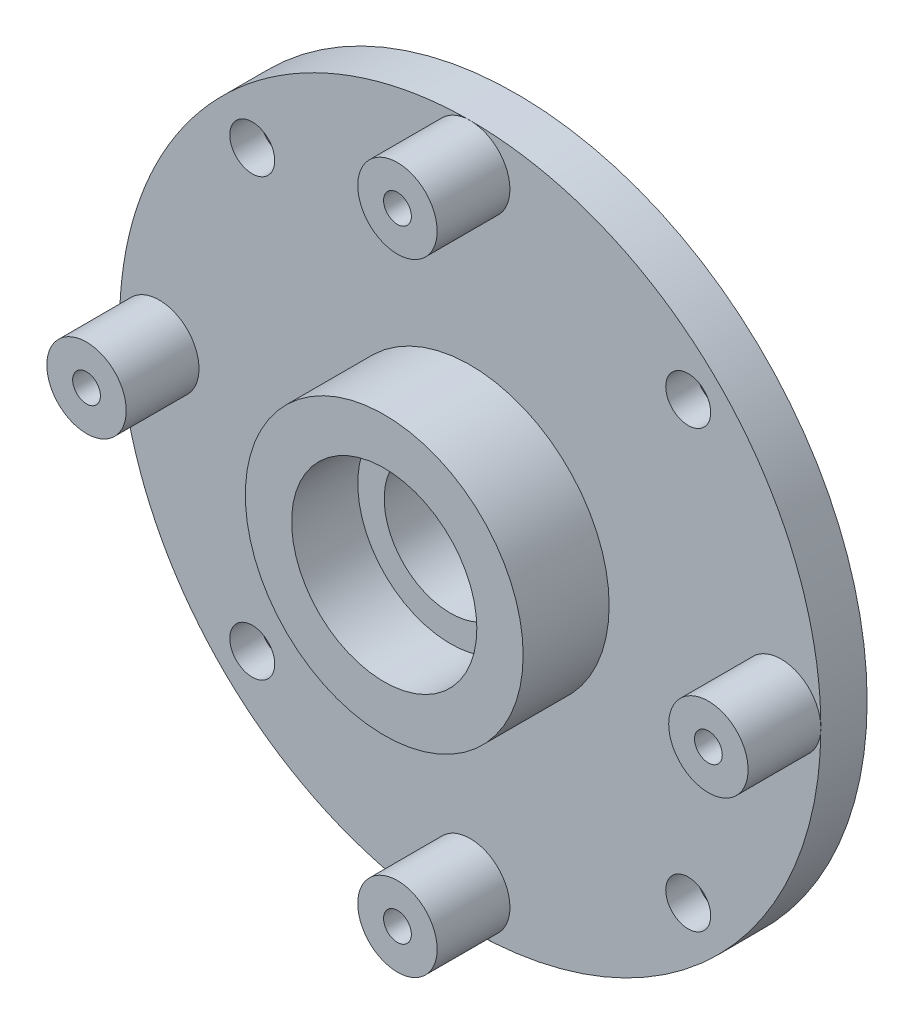
ISO-10303-21;
HEADER;
FILE_DESCRIPTION(('STEP AP214'),'2;1');
FILE_NAME('part.step','',(''),(''),'','','');
FILE_SCHEMA(('AUTOMOTIVE_DESIGN { 1 0 10303 214 1 1 1 1 }'));
ENDSEC;
DATA;
#1=APPLICATION_CONTEXT('core data for automotive mechanical design processes');
#2=APPLICATION_PROTOCOL_DEFINITION('international standard','automotive_design',2000,#1);
#3=PRODUCT_CONTEXT('',#1,'mechanical');
#4=PRODUCT('Part','Part','',(#3));
#5=PRODUCT_RELATED_PRODUCT_CATEGORY('part','',(#4));
#6=PRODUCT_DEFINITION_FORMATION('','',#4);
#7=PRODUCT_DEFINITION_CONTEXT('part definition',#1,'design');
#8=PRODUCT_DEFINITION('design','',#6,#7);
#9=PRODUCT_DEFINITION_SHAPE('','',#8);
#10=(LENGTH_UNIT() NAMED_UNIT(*) SI_UNIT(.MILLI.,.METRE.));
#11=(NAMED_UNIT(*) PLANE_ANGLE_UNIT() SI_UNIT($,.RADIAN.));
#12=(NAMED_UNIT(*) SI_UNIT($,.STERADIAN.) SOLID_ANGLE_UNIT());
#13=UNCERTAINTY_MEASURE_WITH_UNIT(LENGTH_MEASURE(1.E-05),#10,'distance_accuracy_value','');
#14=(GEOMETRIC_REPRESENTATION_CONTEXT(3) GLOBAL_UNCERTAINTY_ASSIGNED_CONTEXT((#13)) GLOBAL_UNIT_ASSIGNED_CONTEXT((#10,
#11,#12)) REPRESENTATION_CONTEXT('',''));
#15=CARTESIAN_POINT('',(0.,0.,0.));
#16=DIRECTION('',(0.,0.,1.));
#17=DIRECTION('',(1.,0.,0.));
#18=AXIS2_PLACEMENT_3D('',#15,#16,#17);
#19=CARTESIAN_POINT('',(0.,0.,10.));
#20=DIRECTION('',(0.,0.,1.));
#21=DIRECTION('',(1.,0.,0.));
#22=AXIS2_PLACEMENT_3D('',#19,#20,#21);
#23=CYLINDRICAL_SURFACE('',#22,5.);
#24=CARTESIAN_POINT('',(0.,0.,-35.2));
#25=DIRECTION('',(0.,0.,1.));
#26=DIRECTION('',(1.,0.,0.));
#27=AXIS2_PLACEMENT_3D('',#24,#25,#26);
#28=CIRCLE('',#27,5.);
#29=CARTESIAN_POINT('',(5.,0.,-35.2));
#30=VERTEX_POINT('',#29);
#31=EDGE_CURVE('E89',#30,#30,#28,.T.);
#32=ORIENTED_EDGE('',*,*,#31,.T.);
#33=EDGE_LOOP('',(#32));
#34=FACE_BOUND('',#33,.T.);
#35=CARTESIAN_POINT('',(0.,0.,-40.2));
#36=DIRECTION('',(0.,0.,1.));
#37=DIRECTION('',(1.,0.,0.));
#38=AXIS2_PLACEMENT_3D('',#35,#36,#37);
#39=CIRCLE('',#38,5.);
#40=CARTESIAN_POINT('',(5.,0.,-40.2));
#41=VERTEX_POINT('',#40);
#42=EDGE_CURVE('E113',#41,#41,#39,.T.);
#43=ORIENTED_EDGE('',*,*,#42,.F.);
#44=EDGE_LOOP('',(#43));
#45=FACE_BOUND('',#44,.T.);
#46=ADVANCED_FACE('F41',(#34,#45),#23,.F.);
#47=CARTESIAN_POINT('',(5.,0.,-40.2));
#48=DIRECTION('',(0.,0.,-1.));
#49=DIRECTION('',(-1.,0.,0.));
#50=AXIS2_PLACEMENT_3D('',#47,#48,#49);
#51=PLANE('',#50);
#52=CARTESIAN_POINT('',(16.4755880016464,16.4755880016467,-40.2));
#53=DIRECTION('',(0.,0.,-1.));
#54=DIRECTION('',(-1.,0.,0.));
#55=AXIS2_PLACEMENT_3D('',#52,#53,#54);
#56=CIRCLE('',#55,2.79999999999999);
#57=CARTESIAN_POINT('',(13.6755880016464,16.4755880016467,-40.2));
#58=VERTEX_POINT('',#57);
#59=EDGE_CURVE('E152',#58,#58,#56,.F.);
#60=ORIENTED_EDGE('',*,*,#59,.T.);
#61=EDGE_LOOP('',(#60));
#62=FACE_BOUND('',#61,.T.);
#63=CARTESIAN_POINT('',(16.4755880016466,-16.4755880016466,-40.2));
#64=DIRECTION('',(0.,0.,-1.));
#65=DIRECTION('',(-1.,0.,0.));
#66=AXIS2_PLACEMENT_3D('',#63,#64,#65);
#67=CIRCLE('',#66,2.79999999999999);
#68=CARTESIAN_POINT('',(13.6755880016466,-16.4755880016466,-40.2));
#69=VERTEX_POINT('',#68);
#70=EDGE_CURVE('E149',#69,#69,#67,.F.);
#71=ORIENTED_EDGE('',*,*,#70,.T.);
#72=EDGE_LOOP('',(#71));
#73=FACE_BOUND('',#72,.T.);
#74=CARTESIAN_POINT('',(-16.4755880016465,-16.4755880016466,-40.2));
#75=DIRECTION('',(0.,0.,-1.));
#76=DIRECTION('',(-1.,0.,0.));
#77=AXIS2_PLACEMENT_3D('',#74,#75,#76);
#78=CIRCLE('',#77,2.80000000000001);
#79=CARTESIAN_POINT('',(-19.2755880016465,-16.4755880016466,-40.2));
#80=VERTEX_POINT('',#79);
#81=EDGE_CURVE('E146',#80,#80,#78,.F.);
#82=ORIENTED_EDGE('',*,*,#81,.T.);
#83=EDGE_LOOP('',(#82));
#84=FACE_BOUND('',#83,.T.);
#85=CARTESIAN_POINT('',(-16.4755880016466,16.4755880016466,-40.2));
#86=DIRECTION('',(0.,0.,-1.));
#87=DIRECTION('',(-1.,0.,0.));
#88=AXIS2_PLACEMENT_3D('',#85,#86,#87);
#89=CIRCLE('',#88,2.79999999999999);
#90=CARTESIAN_POINT('',(-19.2755880016466,16.4755880016466,-40.2));
#91=VERTEX_POINT('',#90);
#92=EDGE_CURVE('E116',#91,#91,#89,.F.);
#93=ORIENTED_EDGE('',*,*,#92,.T.);
#94=EDGE_LOOP('',(#93));
#95=FACE_BOUND('',#94,.T.);
#96=CARTESIAN_POINT('',(1.6985546288162E-13,-23.5,-40.2));
#97=DIRECTION('',(0.,0.,1.));
#98=DIRECTION('',(0.,1.,0.));
#99=AXIS2_PLACEMENT_3D('',#96,#97,#98);
#100=CIRCLE('',#99,1.05);
#101=CARTESIAN_POINT('',(1.66189407475835E-13,-22.45,-40.2));
#102=VERTEX_POINT('',#101);
#103=EDGE_CURVE('E125',#102,#102,#100,.T.);
#104=ORIENTED_EDGE('',*,*,#103,.T.);
#105=EDGE_LOOP('',(#104));
#106=FACE_BOUND('',#105,.T.);
#107=CARTESIAN_POINT('',(23.5,0.,-40.2));
#108=DIRECTION('',(0.,0.,1.));
#109=DIRECTION('',(-1.,0.,0.));
#110=AXIS2_PLACEMENT_3D('',#107,#108,#109);
#111=CIRCLE('',#110,1.05);
#112=CARTESIAN_POINT('',(22.45,0.,-40.2));
#113=VERTEX_POINT('',#112);
#114=EDGE_CURVE('E186',#113,#113,#111,.T.);
#115=ORIENTED_EDGE('',*,*,#114,.T.);
#116=EDGE_LOOP('',(#115));
#117=FACE_BOUND('',#116,.T.);
#118=CARTESIAN_POINT('',(-3.33955085807247E-13,23.5,-40.2));
#119=DIRECTION('',(0.,0.,1.));
#120=DIRECTION('',(0.,-1.,0.));
#121=AXIS2_PLACEMENT_3D('',#118,#119,#120);
#122=CIRCLE('',#121,1.05);
#123=CARTESIAN_POINT('',(-3.22956919589891E-13,22.45,-40.2));
#124=VERTEX_POINT('',#123);
#125=EDGE_CURVE('E134',#124,#124,#122,.T.);
#126=ORIENTED_EDGE('',*,*,#125,.T.);
#127=EDGE_LOOP('',(#126));
#128=FACE_BOUND('',#127,.T.);
#129=CARTESIAN_POINT('',(-23.5,0.,-40.2));
#130=DIRECTION('',(0.,0.,1.));
#131=DIRECTION('',(1.,0.,0.));
#132=AXIS2_PLACEMENT_3D('',#129,#130,#131);
#133=CIRCLE('',#132,1.05);
#134=CARTESIAN_POINT('',(-22.45,0.,-40.2));
#135=VERTEX_POINT('',#134);
#136=EDGE_CURVE('E120',#135,#135,#133,.T.);
#137=ORIENTED_EDGE('',*,*,#136,.T.);
#138=EDGE_LOOP('',(#137));
#139=FACE_BOUND('',#138,.T.);
#140=ORIENTED_EDGE('',*,*,#42,.T.);
#141=EDGE_LOOP('',(#140));
#142=FACE_BOUND('',#141,.T.);
#143=CARTESIAN_POINT('',(0.,0.,-40.2));
#144=DIRECTION('',(0.,0.,1.));
#145=DIRECTION('',(1.,0.,0.));
#146=AXIS2_PLACEMENT_3D('',#143,#144,#145);
#147=CIRCLE('',#146,26.5);
#148=CARTESIAN_POINT('',(26.5,0.,-40.2));
#149=VERTEX_POINT('',#148);
#150=EDGE_CURVE('E109',#149,#149,#147,.T.);
#151=ORIENTED_EDGE('',*,*,#150,.F.);
#152=EDGE_LOOP('',(#151));
#153=FACE_BOUND('',#152,.T.);
#154=ADVANCED_FACE('F172',(#62,#73,#84,#95,#106,#117,#128,#139,#142,#153),#51,.T.);
#155=CARTESIAN_POINT('',(0.,0.,10.));
#156=DIRECTION('',(0.,0.,1.));
#157=DIRECTION('',(1.,0.,0.));
#158=AXIS2_PLACEMENT_3D('',#155,#156,#157);
#159=CYLINDRICAL_SURFACE('',#158,26.5);
#160=ORIENTED_EDGE('',*,*,#150,.T.);
#161=EDGE_LOOP('',(#160));
#162=FACE_BOUND('',#161,.T.);
#163=CARTESIAN_POINT('',(0.,0.,-36.7));
#164=DIRECTION('',(0.,0.,1.));
#165=DIRECTION('',(1.,0.,0.));
#166=AXIS2_PLACEMENT_3D('',#163,#164,#165);
#167=CIRCLE('',#166,26.5);
#168=CARTESIAN_POINT('',(-26.5,0.,-36.7));
#169=VERTEX_POINT('',#168);
#170=CARTESIAN_POINT('',(1.91539138994167E-13,-26.5,-36.7));
#171=VERTEX_POINT('',#170);
#172=EDGE_CURVE('E82',#169,#171,#167,.T.);
#173=ORIENTED_EDGE('',*,*,#172,.F.);
#174=CARTESIAN_POINT('',(-3.76587649952853E-13,26.5,-36.7));
#175=VERTEX_POINT('',#174);
#176=EDGE_CURVE('E69',#175,#169,#167,.T.);
#177=ORIENTED_EDGE('',*,*,#176,.F.);
#178=CARTESIAN_POINT('',(26.5,0.,-36.7));
#179=VERTEX_POINT('',#178);
#180=EDGE_CURVE('E79',#179,#175,#167,.T.);
#181=ORIENTED_EDGE('',*,*,#180,.F.);
#182=EDGE_CURVE('E110',#171,#179,#167,.T.);
#183=ORIENTED_EDGE('',*,*,#182,.F.);
#184=EDGE_LOOP('',(#173,#177,#181,#183));
#185=FACE_BOUND('',#184,.T.);
#186=ADVANCED_FACE('F175',(#162,#185),#159,.T.);
#187=CARTESIAN_POINT('',(26.5,0.,-36.7));
#188=DIRECTION('',(0.,0.,1.));
#189=DIRECTION('',(1.,0.,0.));
#190=AXIS2_PLACEMENT_3D('',#187,#188,#189);
#191=PLANE('',#190);
#192=CARTESIAN_POINT('',(-16.4755880016465,-16.4755880016466,-36.7));
#193=DIRECTION('',(0.,0.,1.));
#194=DIRECTION('',(1.,0.,0.));
#195=AXIS2_PLACEMENT_3D('',#192,#193,#194);
#196=CIRCLE('',#195,1.7);
#197=CARTESIAN_POINT('',(-14.7755880016465,-16.4755880016466,-36.7));
#198=VERTEX_POINT('',#197);
#199=EDGE_CURVE('E135',#198,#198,#196,.F.);
#200=ORIENTED_EDGE('',*,*,#199,.T.);
#201=EDGE_LOOP('',(#200));
#202=FACE_BOUND('',#201,.T.);
#203=CARTESIAN_POINT('',(16.4755880016466,-16.4755880016466,-36.7));
#204=DIRECTION('',(0.,0.,1.));
#205=DIRECTION('',(1.,0.,0.));
#206=AXIS2_PLACEMENT_3D('',#203,#204,#205);
#207=CIRCLE('',#206,1.7);
#208=CARTESIAN_POINT('',(18.1755880016466,-16.4755880016466,-36.7));
#209=VERTEX_POINT('',#208);
#210=EDGE_CURVE('E139',#209,#209,#207,.F.);
#211=ORIENTED_EDGE('',*,*,#210,.T.);
#212=EDGE_LOOP('',(#211));
#213=FACE_BOUND('',#212,.T.);
#214=CARTESIAN_POINT('',(16.4755880016464,16.4755880016467,-36.7));
#215=DIRECTION('',(0.,0.,1.));
#216=DIRECTION('',(1.,0.,0.));
#217=AXIS2_PLACEMENT_3D('',#214,#215,#216);
#218=CIRCLE('',#217,1.7);
#219=CARTESIAN_POINT('',(18.1755880016464,16.4755880016467,-36.7));
#220=VERTEX_POINT('',#219);
#221=EDGE_CURVE('E136',#220,#220,#218,.F.);
#222=ORIENTED_EDGE('',*,*,#221,.T.);
#223=EDGE_LOOP('',(#222));
#224=FACE_BOUND('',#223,.T.);
#225=CARTESIAN_POINT('',(-16.4755880016466,16.4755880016466,-36.7));
#226=DIRECTION('',(0.,0.,1.));
#227=DIRECTION('',(1.,0.,0.));
#228=AXIS2_PLACEMENT_3D('',#225,#226,#227);
#229=CIRCLE('',#228,1.7);
#230=CARTESIAN_POINT('',(-14.7755880016466,16.4755880016466,-36.7));
#231=VERTEX_POINT('',#230);
#232=EDGE_CURVE('E131',#231,#231,#229,.F.);
#233=ORIENTED_EDGE('',*,*,#232,.T.);
#234=EDGE_LOOP('',(#233));
#235=FACE_BOUND('',#234,.T.);
#236=ORIENTED_EDGE('',*,*,#180,.T.);
#237=CARTESIAN_POINT('',(-3.33955085807247E-13,23.5,-36.7));
#238=DIRECTION('',(0.,0.,1.));
#239=DIRECTION('',(0.,-1.,0.));
#240=AXIS2_PLACEMENT_3D('',#237,#238,#239);
#241=CIRCLE('',#240,3.);
#242=EDGE_CURVE('E55',#175,#175,#241,.T.);
#243=ORIENTED_EDGE('',*,*,#242,.F.);
#244=ORIENTED_EDGE('',*,*,#176,.T.);
#245=CARTESIAN_POINT('',(-23.5,0.,-36.7));
#246=DIRECTION('',(0.,0.,1.));
#247=DIRECTION('',(1.,0.,0.));
#248=AXIS2_PLACEMENT_3D('',#245,#246,#247);
#249=CIRCLE('',#248,3.);
#250=EDGE_CURVE('E75',#169,#169,#249,.T.);
#251=ORIENTED_EDGE('',*,*,#250,.F.);
#252=ORIENTED_EDGE('',*,*,#172,.T.);
#253=CARTESIAN_POINT('',(1.6985546288162E-13,-23.5,-36.7));
#254=DIRECTION('',(0.,0.,1.));
#255=DIRECTION('',(0.,1.,0.));
#256=AXIS2_PLACEMENT_3D('',#253,#254,#255);
#257=CIRCLE('',#256,3.);
#258=EDGE_CURVE('E92',#171,#171,#257,.T.);
#259=ORIENTED_EDGE('',*,*,#258,.F.);
#260=ORIENTED_EDGE('',*,*,#182,.T.);
#261=CARTESIAN_POINT('',(23.5,0.,-36.7));
#262=DIRECTION('',(0.,0.,1.));
#263=DIRECTION('',(-1.,0.,0.));
#264=AXIS2_PLACEMENT_3D('',#261,#262,#263);
#265=CIRCLE('',#264,3.);
#266=EDGE_CURVE('E60',#179,#179,#265,.T.);
#267=ORIENTED_EDGE('',*,*,#266,.F.);
#268=EDGE_LOOP('',(#236,#243,#244,#251,#252,#259,#260,#267));
#269=FACE_BOUND('',#268,.T.);
#270=CARTESIAN_POINT('',(0.,0.,-36.7));
#271=DIRECTION('',(0.,0.,1.));
#272=DIRECTION('',(1.,0.,0.));
#273=AXIS2_PLACEMENT_3D('',#270,#271,#272);
#274=CIRCLE('',#273,10.5);
#275=CARTESIAN_POINT('',(10.5,0.,-36.7));
#276=VERTEX_POINT('',#275);
#277=EDGE_CURVE('E80',#276,#276,#274,.T.);
#278=ORIENTED_EDGE('',*,*,#277,.F.);
#279=EDGE_LOOP('',(#278));
#280=FACE_BOUND('',#279,.T.);
#281=ADVANCED_FACE('F72',(#202,#213,#224,#235,#269,#280),#191,.T.);
#282=CARTESIAN_POINT('',(0.,0.,10.));
#283=DIRECTION('',(0.,0.,1.));
#284=DIRECTION('',(1.,0.,0.));
#285=AXIS2_PLACEMENT_3D('',#282,#283,#284);
#286=CYLINDRICAL_SURFACE('',#285,10.5);
#287=ORIENTED_EDGE('',*,*,#277,.T.);
#288=EDGE_LOOP('',(#287));
#289=FACE_BOUND('',#288,.T.);
#290=CARTESIAN_POINT('',(0.,0.,-30.2));
#291=DIRECTION('',(0.,0.,1.));
#292=DIRECTION('',(1.,0.,0.));
#293=AXIS2_PLACEMENT_3D('',#290,#291,#292);
#294=CIRCLE('',#293,10.5);
#295=CARTESIAN_POINT('',(10.5,0.,-30.2));
#296=VERTEX_POINT('',#295);
#297=EDGE_CURVE('E104',#296,#296,#294,.T.);
#298=ORIENTED_EDGE('',*,*,#297,.F.);
#299=EDGE_LOOP('',(#298));
#300=FACE_BOUND('',#299,.T.);
#301=ADVANCED_FACE('F273',(#289,#300),#286,.T.);
#302=CARTESIAN_POINT('',(10.5,0.,-30.2));
#303=DIRECTION('',(0.,0.,1.));
#304=DIRECTION('',(1.,0.,0.));
#305=AXIS2_PLACEMENT_3D('',#302,#303,#304);
#306=PLANE('',#305);
#307=ORIENTED_EDGE('',*,*,#297,.T.);
#308=EDGE_LOOP('',(#307));
#309=FACE_BOUND('',#308,.T.);
#310=CARTESIAN_POINT('',(0.,0.,-30.2));
#311=DIRECTION('',(0.,0.,1.));
#312=DIRECTION('',(1.,0.,0.));
#313=AXIS2_PLACEMENT_3D('',#310,#311,#312);
#314=CIRCLE('',#313,7.);
#315=CARTESIAN_POINT('',(7.,0.,-30.2));
#316=VERTEX_POINT('',#315);
#317=EDGE_CURVE('E101',#316,#316,#314,.T.);
#318=ORIENTED_EDGE('',*,*,#317,.F.);
#319=EDGE_LOOP('',(#318));
#320=FACE_BOUND('',#319,.T.);
#321=ADVANCED_FACE('F329',(#309,#320),#306,.T.);
#322=CARTESIAN_POINT('',(0.,0.,10.));
#323=DIRECTION('',(0.,0.,1.));
#324=DIRECTION('',(1.,0.,0.));
#325=AXIS2_PLACEMENT_3D('',#322,#323,#324);
#326=CYLINDRICAL_SURFACE('',#325,7.);
#327=ORIENTED_EDGE('',*,*,#317,.T.);
#328=EDGE_LOOP('',(#327));
#329=FACE_BOUND('',#328,.T.);
#330=CARTESIAN_POINT('',(0.,0.,-35.2));
#331=DIRECTION('',(0.,0.,1.));
#332=DIRECTION('',(1.,0.,0.));
#333=AXIS2_PLACEMENT_3D('',#330,#331,#332);
#334=CIRCLE('',#333,7.);
#335=CARTESIAN_POINT('',(7.,0.,-35.2));
#336=VERTEX_POINT('',#335);
#337=EDGE_CURVE('E98',#336,#336,#334,.T.);
#338=ORIENTED_EDGE('',*,*,#337,.F.);
#339=EDGE_LOOP('',(#338));
#340=FACE_BOUND('',#339,.T.);
#341=ADVANCED_FACE('F322',(#329,#340),#326,.F.);
#342=CARTESIAN_POINT('',(7.,0.,-35.2));
#343=DIRECTION('',(0.,0.,1.));
#344=DIRECTION('',(1.,0.,0.));
#345=AXIS2_PLACEMENT_3D('',#342,#343,#344);
#346=PLANE('',#345);
#347=ORIENTED_EDGE('',*,*,#337,.T.);
#348=EDGE_LOOP('',(#347));
#349=FACE_BOUND('',#348,.T.);
#350=ORIENTED_EDGE('',*,*,#31,.F.);
#351=EDGE_LOOP('',(#350));
#352=FACE_BOUND('',#351,.T.);
#353=ADVANCED_FACE('F317',(#349,#352),#346,.T.);
#354=CARTESIAN_POINT('',(-23.5,0.,-31.2));
#355=DIRECTION('',(0.,0.,-1.));
#356=DIRECTION('',(-1.,0.,0.));
#357=AXIS2_PLACEMENT_3D('',#354,#355,#356);
#358=CYLINDRICAL_SURFACE('',#357,3.);
#359=CARTESIAN_POINT('',(-23.5,0.,-31.2));
#360=DIRECTION('',(0.,0.,1.));
#361=DIRECTION('',(1.,0.,0.));
#362=AXIS2_PLACEMENT_3D('',#359,#360,#361);
#363=CIRCLE('',#362,3.);
#364=CARTESIAN_POINT('',(-20.5,0.,-31.2));
#365=VERTEX_POINT('',#364);
#366=EDGE_CURVE('E85',#365,#365,#363,.T.);
#367=ORIENTED_EDGE('',*,*,#366,.F.);
#368=EDGE_LOOP('',(#367));
#369=FACE_BOUND('',#368,.T.);
#370=ORIENTED_EDGE('',*,*,#250,.T.);
#371=EDGE_LOOP('',(#370));
#372=FACE_BOUND('',#371,.T.);
#373=ADVANCED_FACE('F84',(#369,#372),#358,.T.);
#374=CARTESIAN_POINT('',(-23.5,0.,-31.2));
#375=DIRECTION('',(0.,0.,1.));
#376=DIRECTION('',(1.,0.,0.));
#377=AXIS2_PLACEMENT_3D('',#374,#375,#376);
#378=PLANE('',#377);
#379=CARTESIAN_POINT('',(-23.5,0.,-31.2));
#380=DIRECTION('',(0.,0.,1.));
#381=DIRECTION('',(1.,0.,0.));
#382=AXIS2_PLACEMENT_3D('',#379,#380,#381);
#383=CIRCLE('',#382,1.05);
#384=CARTESIAN_POINT('',(-22.45,0.,-31.2));
#385=VERTEX_POINT('',#384);
#386=EDGE_CURVE('E117',#385,#385,#383,.F.);
#387=ORIENTED_EDGE('',*,*,#386,.T.);
#388=EDGE_LOOP('',(#387));
#389=FACE_BOUND('',#388,.T.);
#390=ORIENTED_EDGE('',*,*,#366,.T.);
#391=EDGE_LOOP('',(#390));
#392=FACE_BOUND('',#391,.T.);
#393=ADVANCED_FACE('F309',(#389,#392),#378,.T.);
#394=CARTESIAN_POINT('',(1.6985546288162E-13,-23.5,-31.2));
#395=DIRECTION('',(0.,0.,-1.));
#396=DIRECTION('',(-1.,0.,0.));
#397=AXIS2_PLACEMENT_3D('',#394,#395,#396);
#398=CYLINDRICAL_SURFACE('',#397,3.);
#399=CARTESIAN_POINT('',(1.6985546288162E-13,-23.5,-31.2));
#400=DIRECTION('',(0.,0.,1.));
#401=DIRECTION('',(0.,1.,0.));
#402=AXIS2_PLACEMENT_3D('',#399,#400,#401);
#403=CIRCLE('',#402,3.);
#404=CARTESIAN_POINT('',(1.5938101886509E-13,-20.5,-31.2));
#405=VERTEX_POINT('',#404);
#406=EDGE_CURVE('E86',#405,#405,#403,.T.);
#407=ORIENTED_EDGE('',*,*,#406,.F.);
#408=EDGE_LOOP('',(#407));
#409=FACE_BOUND('',#408,.T.);
#410=ORIENTED_EDGE('',*,*,#258,.T.);
#411=EDGE_LOOP('',(#410));
#412=FACE_BOUND('',#411,.T.);
#413=ADVANCED_FACE('F312',(#409,#412),#398,.T.);
#414=CARTESIAN_POINT('',(1.6985546288162E-13,-23.5,-31.2));
#415=DIRECTION('',(0.,0.,1.));
#416=DIRECTION('',(0.,1.,0.));
#417=AXIS2_PLACEMENT_3D('',#414,#415,#416);
#418=PLANE('',#417);
#419=CARTESIAN_POINT('',(1.6985546288162E-13,-23.5,-31.2));
#420=DIRECTION('',(0.,0.,1.));
#421=DIRECTION('',(1.,0.,0.));
#422=AXIS2_PLACEMENT_3D('',#419,#420,#421);
#423=CIRCLE('',#422,1.05);
#424=CARTESIAN_POINT('',(1.05000000000017,-23.5,-31.2));
#425=VERTEX_POINT('',#424);
#426=EDGE_CURVE('E128',#425,#425,#423,.F.);
#427=ORIENTED_EDGE('',*,*,#426,.T.);
#428=EDGE_LOOP('',(#427));
#429=FACE_BOUND('',#428,.T.);
#430=ORIENTED_EDGE('',*,*,#406,.T.);
#431=EDGE_LOOP('',(#430));
#432=FACE_BOUND('',#431,.T.);
#433=ADVANCED_FACE('F386',(#429,#432),#418,.T.);
#434=CARTESIAN_POINT('',(23.5,0.,-31.2));
#435=DIRECTION('',(0.,0.,-1.));
#436=DIRECTION('',(-1.,0.,0.));
#437=AXIS2_PLACEMENT_3D('',#434,#435,#436);
#438=CYLINDRICAL_SURFACE('',#437,3.);
#439=CARTESIAN_POINT('',(23.5,0.,-31.2));
#440=DIRECTION('',(0.,0.,1.));
#441=DIRECTION('',(-1.,0.,0.));
#442=AXIS2_PLACEMENT_3D('',#439,#440,#441);
#443=CIRCLE('',#442,3.);
#444=CARTESIAN_POINT('',(20.5,0.,-31.2));
#445=VERTEX_POINT('',#444);
#446=EDGE_CURVE('E203',#445,#445,#443,.T.);
#447=ORIENTED_EDGE('',*,*,#446,.F.);
#448=EDGE_LOOP('',(#447));
#449=FACE_BOUND('',#448,.T.);
#450=ORIENTED_EDGE('',*,*,#266,.T.);
#451=EDGE_LOOP('',(#450));
#452=FACE_BOUND('',#451,.T.);
#453=ADVANCED_FACE('F230',(#449,#452),#438,.T.);
#454=CARTESIAN_POINT('',(23.5,0.,-31.2));
#455=DIRECTION('',(0.,0.,1.));
#456=DIRECTION('',(-1.,0.,0.));
#457=AXIS2_PLACEMENT_3D('',#454,#455,#456);
#458=PLANE('',#457);
#459=CARTESIAN_POINT('',(23.5,0.,-31.2));
#460=DIRECTION('',(0.,0.,1.));
#461=DIRECTION('',(1.,0.,0.));
#462=AXIS2_PLACEMENT_3D('',#459,#460,#461);
#463=CIRCLE('',#462,1.05);
#464=CARTESIAN_POINT('',(24.55,0.,-31.2));
#465=VERTEX_POINT('',#464);
#466=EDGE_CURVE('E124',#465,#465,#463,.F.);
#467=ORIENTED_EDGE('',*,*,#466,.T.);
#468=EDGE_LOOP('',(#467));
#469=FACE_BOUND('',#468,.T.);
#470=ORIENTED_EDGE('',*,*,#446,.T.);
#471=EDGE_LOOP('',(#470));
#472=FACE_BOUND('',#471,.T.);
#473=ADVANCED_FACE('F221',(#469,#472),#458,.T.);
#474=CARTESIAN_POINT('',(-3.33955085807247E-13,23.5,-31.2));
#475=DIRECTION('',(0.,0.,-1.));
#476=DIRECTION('',(-1.,0.,0.));
#477=AXIS2_PLACEMENT_3D('',#474,#475,#476);
#478=CYLINDRICAL_SURFACE('',#477,3.);
#479=CARTESIAN_POINT('',(-3.33955085807247E-13,23.5,-31.2));
#480=DIRECTION('',(0.,0.,1.));
#481=DIRECTION('',(0.,-1.,0.));
#482=AXIS2_PLACEMENT_3D('',#479,#480,#481);
#483=CIRCLE('',#482,3.);
#484=CARTESIAN_POINT('',(-3.02531753757659E-13,20.5,-31.2));
#485=VERTEX_POINT('',#484);
#486=EDGE_CURVE('E207',#485,#485,#483,.T.);
#487=ORIENTED_EDGE('',*,*,#486,.F.);
#488=EDGE_LOOP('',(#487));
#489=FACE_BOUND('',#488,.T.);
#490=ORIENTED_EDGE('',*,*,#242,.T.);
#491=EDGE_LOOP('',(#490));
#492=FACE_BOUND('',#491,.T.);
#493=ADVANCED_FACE('F219',(#489,#492),#478,.T.);
#494=CARTESIAN_POINT('',(-3.33955085807247E-13,23.5,-31.2));
#495=DIRECTION('',(0.,0.,1.));
#496=DIRECTION('',(0.,-1.,0.));
#497=AXIS2_PLACEMENT_3D('',#494,#495,#496);
#498=PLANE('',#497);
#499=CARTESIAN_POINT('',(-3.33955085807247E-13,23.5,-31.2));
#500=DIRECTION('',(0.,0.,1.));
#501=DIRECTION('',(1.,0.,0.));
#502=AXIS2_PLACEMENT_3D('',#499,#500,#501);
#503=CIRCLE('',#502,1.05);
#504=CARTESIAN_POINT('',(1.04999999999966,23.5,-31.2));
#505=VERTEX_POINT('',#504);
#506=EDGE_CURVE('E121',#505,#505,#503,.F.);
#507=ORIENTED_EDGE('',*,*,#506,.T.);
#508=EDGE_LOOP('',(#507));
#509=FACE_BOUND('',#508,.T.);
#510=ORIENTED_EDGE('',*,*,#486,.T.);
#511=EDGE_LOOP('',(#510));
#512=FACE_BOUND('',#511,.T.);
#513=ADVANCED_FACE('F217',(#509,#512),#498,.T.);
#514=CARTESIAN_POINT('',(-23.5,0.,-30.2));
#515=DIRECTION('',(0.,0.,-1.));
#516=DIRECTION('',(-1.,0.,0.));
#517=AXIS2_PLACEMENT_3D('',#514,#515,#516);
#518=CYLINDRICAL_SURFACE('',#517,1.05);
#519=ORIENTED_EDGE('',*,*,#386,.F.);
#520=EDGE_LOOP('',(#519));
#521=FACE_BOUND('',#520,.T.);
#522=ORIENTED_EDGE('',*,*,#136,.F.);
#523=EDGE_LOOP('',(#522));
#524=FACE_BOUND('',#523,.T.);
#525=ADVANCED_FACE('F227',(#521,#524),#518,.F.);
#526=CARTESIAN_POINT('',(-3.33955085807247E-13,23.5,-30.2));
#527=DIRECTION('',(0.,0.,-1.));
#528=DIRECTION('',(-1.,0.,0.));
#529=AXIS2_PLACEMENT_3D('',#526,#527,#528);
#530=CYLINDRICAL_SURFACE('',#529,1.05);
#531=ORIENTED_EDGE('',*,*,#506,.F.);
#532=EDGE_LOOP('',(#531));
#533=FACE_BOUND('',#532,.T.);
#534=ORIENTED_EDGE('',*,*,#125,.F.);
#535=EDGE_LOOP('',(#534));
#536=FACE_BOUND('',#535,.T.);
#537=ADVANCED_FACE('F297',(#533,#536),#530,.F.);
#538=CARTESIAN_POINT('',(23.5,0.,-30.2));
#539=DIRECTION('',(0.,0.,-1.));
#540=DIRECTION('',(-1.,0.,0.));
#541=AXIS2_PLACEMENT_3D('',#538,#539,#540);
#542=CYLINDRICAL_SURFACE('',#541,1.05);
#543=ORIENTED_EDGE('',*,*,#466,.F.);
#544=EDGE_LOOP('',(#543));
#545=FACE_BOUND('',#544,.T.);
#546=ORIENTED_EDGE('',*,*,#114,.F.);
#547=EDGE_LOOP('',(#546));
#548=FACE_BOUND('',#547,.T.);
#549=ADVANCED_FACE('F291',(#545,#548),#542,.F.);
#550=CARTESIAN_POINT('',(1.6985546288162E-13,-23.5,-30.2));
#551=DIRECTION('',(0.,0.,-1.));
#552=DIRECTION('',(-1.,0.,0.));
#553=AXIS2_PLACEMENT_3D('',#550,#551,#552);
#554=CYLINDRICAL_SURFACE('',#553,1.05);
#555=ORIENTED_EDGE('',*,*,#426,.F.);
#556=EDGE_LOOP('',(#555));
#557=FACE_BOUND('',#556,.T.);
#558=ORIENTED_EDGE('',*,*,#103,.F.);
#559=EDGE_LOOP('',(#558));
#560=FACE_BOUND('',#559,.T.);
#561=ADVANCED_FACE('F282',(#557,#560),#554,.F.);
#562=CARTESIAN_POINT('',(-16.4755880016466,16.4755880016466,-30.2));
#563=DIRECTION('',(0.,0.,-1.));
#564=DIRECTION('',(-1.,0.,0.));
#565=AXIS2_PLACEMENT_3D('',#562,#563,#564);
#566=CYLINDRICAL_SURFACE('',#565,1.7);
#567=CARTESIAN_POINT('',(-16.4755880016466,16.4755880016466,-39.029));
#568=DIRECTION('',(0.,0.,-1.));
#569=DIRECTION('',(-1.,0.,0.));
#570=AXIS2_PLACEMENT_3D('',#567,#568,#569);
#571=CIRCLE('',#570,1.7);
#572=CARTESIAN_POINT('',(-18.1755880016466,16.4755880016466,-39.029));
#573=VERTEX_POINT('',#572);
#574=EDGE_CURVE('E11',#573,#573,#571,.T.);
#575=ORIENTED_EDGE('',*,*,#574,.T.);
#576=EDGE_LOOP('',(#575));
#577=FACE_BOUND('',#576,.T.);
#578=ORIENTED_EDGE('',*,*,#232,.F.);
#579=EDGE_LOOP('',(#578));
#580=FACE_BOUND('',#579,.T.);
#581=ADVANCED_FACE('F280',(#577,#580),#566,.F.);
#582=CARTESIAN_POINT('',(16.4755880016464,16.4755880016467,-30.2));
#583=DIRECTION('',(0.,0.,-1.));
#584=DIRECTION('',(-1.,0.,0.));
#585=AXIS2_PLACEMENT_3D('',#582,#583,#584);
#586=CYLINDRICAL_SURFACE('',#585,1.7);
#587=CARTESIAN_POINT('',(16.4755880016464,16.4755880016467,-39.029));
#588=DIRECTION('',(0.,0.,-1.));
#589=DIRECTION('',(-1.,0.,0.));
#590=AXIS2_PLACEMENT_3D('',#587,#588,#589);
#591=CIRCLE('',#590,1.7);
#592=CARTESIAN_POINT('',(14.7755880016464,16.4755880016467,-39.029));
#593=VERTEX_POINT('',#592);
#594=EDGE_CURVE('E155',#593,#593,#591,.T.);
#595=ORIENTED_EDGE('',*,*,#594,.T.);
#596=EDGE_LOOP('',(#595));
#597=FACE_BOUND('',#596,.T.);
#598=ORIENTED_EDGE('',*,*,#221,.F.);
#599=EDGE_LOOP('',(#598));
#600=FACE_BOUND('',#599,.T.);
#601=ADVANCED_FACE('F267',(#597,#600),#586,.F.);
#602=CARTESIAN_POINT('',(16.4755880016466,-16.4755880016466,-30.2));
#603=DIRECTION('',(0.,0.,-1.));
#604=DIRECTION('',(-1.,0.,0.));
#605=AXIS2_PLACEMENT_3D('',#602,#603,#604);
#606=CYLINDRICAL_SURFACE('',#605,1.7);
#607=CARTESIAN_POINT('',(16.4755880016466,-16.4755880016466,-39.029));
#608=DIRECTION('',(0.,0.,-1.));
#609=DIRECTION('',(-1.,0.,0.));
#610=AXIS2_PLACEMENT_3D('',#607,#608,#609);
#611=CIRCLE('',#610,1.7);
#612=CARTESIAN_POINT('',(14.7755880016466,-16.4755880016466,-39.029));
#613=VERTEX_POINT('',#612);
#614=EDGE_CURVE('E158',#613,#613,#611,.T.);
#615=ORIENTED_EDGE('',*,*,#614,.T.);
#616=EDGE_LOOP('',(#615));
#617=FACE_BOUND('',#616,.T.);
#618=ORIENTED_EDGE('',*,*,#210,.F.);
#619=EDGE_LOOP('',(#618));
#620=FACE_BOUND('',#619,.T.);
#621=ADVANCED_FACE('F264',(#617,#620),#606,.F.);
#622=CARTESIAN_POINT('',(-16.4755880016465,-16.4755880016466,-30.2));
#623=DIRECTION('',(0.,0.,-1.));
#624=DIRECTION('',(-1.,0.,0.));
#625=AXIS2_PLACEMENT_3D('',#622,#623,#624);
#626=CYLINDRICAL_SURFACE('',#625,1.7);
#627=CARTESIAN_POINT('',(-16.4755880016465,-16.4755880016466,-39.029));
#628=DIRECTION('',(0.,0.,-1.));
#629=DIRECTION('',(-1.,0.,0.));
#630=AXIS2_PLACEMENT_3D('',#627,#628,#629);
#631=CIRCLE('',#630,1.7);
#632=CARTESIAN_POINT('',(-18.1755880016465,-16.4755880016466,-39.029));
#633=VERTEX_POINT('',#632);
#634=EDGE_CURVE('E50',#633,#633,#631,.T.);
#635=ORIENTED_EDGE('',*,*,#634,.T.);
#636=EDGE_LOOP('',(#635));
#637=FACE_BOUND('',#636,.T.);
#638=ORIENTED_EDGE('',*,*,#199,.F.);
#639=EDGE_LOOP('',(#638));
#640=FACE_BOUND('',#639,.T.);
#641=ADVANCED_FACE('F163',(#637,#640),#626,.F.);
#642=CARTESIAN_POINT('',(16.4755880016464,16.4755880016467,-40.2));
#643=DIRECTION('',(0.,0.,-1.));
#644=DIRECTION('',(-1.,0.,0.));
#645=AXIS2_PLACEMENT_3D('',#642,#643,#644);
#646=CONICAL_SURFACE('',#645,2.79999999999999,0.754144582939975);
#647=ORIENTED_EDGE('',*,*,#594,.F.);
#648=EDGE_LOOP('',(#647));
#649=FACE_BOUND('',#648,.T.);
#650=ORIENTED_EDGE('',*,*,#59,.F.);
#651=EDGE_LOOP('',(#650));
#652=FACE_BOUND('',#651,.T.);
#653=ADVANCED_FACE('F241',(#649,#652),#646,.F.);
#654=CARTESIAN_POINT('',(16.4755880016466,-16.4755880016466,-40.2));
#655=DIRECTION('',(0.,0.,-1.));
#656=DIRECTION('',(-1.,0.,0.));
#657=AXIS2_PLACEMENT_3D('',#654,#655,#656);
#658=CONICAL_SURFACE('',#657,2.79999999999999,0.754144582939975);
#659=ORIENTED_EDGE('',*,*,#614,.F.);
#660=EDGE_LOOP('',(#659));
#661=FACE_BOUND('',#660,.T.);
#662=ORIENTED_EDGE('',*,*,#70,.F.);
#663=EDGE_LOOP('',(#662));
#664=FACE_BOUND('',#663,.T.);
#665=ADVANCED_FACE('F169',(#661,#664),#658,.F.);
#666=CARTESIAN_POINT('',(-16.4755880016465,-16.4755880016466,-40.2));
#667=DIRECTION('',(0.,0.,-1.));
#668=DIRECTION('',(-1.,0.,0.));
#669=AXIS2_PLACEMENT_3D('',#666,#667,#668);
#670=CONICAL_SURFACE('',#669,2.80000000000001,0.754144582939975);
#671=ORIENTED_EDGE('',*,*,#634,.F.);
#672=EDGE_LOOP('',(#671));
#673=FACE_BOUND('',#672,.T.);
#674=ORIENTED_EDGE('',*,*,#81,.F.);
#675=EDGE_LOOP('',(#674));
#676=FACE_BOUND('',#675,.T.);
#677=ADVANCED_FACE('F166',(#673,#676),#670,.F.);
#678=CARTESIAN_POINT('',(-16.4755880016466,16.4755880016466,-40.2));
#679=DIRECTION('',(0.,0.,-1.));
#680=DIRECTION('',(-1.,0.,0.));
#681=AXIS2_PLACEMENT_3D('',#678,#679,#680);
#682=CONICAL_SURFACE('',#681,2.79999999999999,0.754144582939975);
#683=ORIENTED_EDGE('',*,*,#574,.F.);
#684=EDGE_LOOP('',(#683));
#685=FACE_BOUND('',#684,.T.);
#686=ORIENTED_EDGE('',*,*,#92,.F.);
#687=EDGE_LOOP('',(#686));
#688=FACE_BOUND('',#687,.T.);
#689=ADVANCED_FACE('F44',(#685,#688),#682,.F.);
#690=CLOSED_SHELL('',(#46,#154,#186,#281,#301,#321,#341,#353,#373,#393,#413,#433,#453,#473,#493,
#513,#525,#537,#549,#561,#581,#601,#621,#641,#653,#665,#677,#689));
#691=MANIFOLD_SOLID_BREP('B2',#690);
#692=ADVANCED_BREP_SHAPE_REPRESENTATION('',(#18,#691),#14);
#693=SHAPE_DEFINITION_REPRESENTATION(#9,#692);
ENDSEC;
END-ISO-10303-21;
